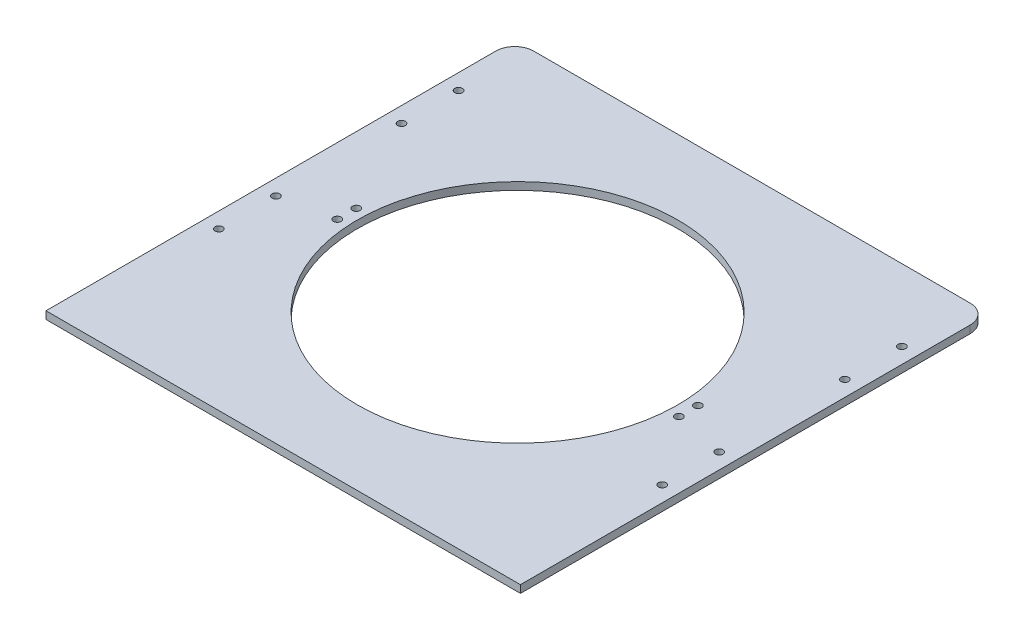
ISO-10303-21;
HEADER;
FILE_DESCRIPTION(('STEP AP214'),'2;1');
FILE_NAME('part.step','',(''),(''),'','','');
FILE_SCHEMA(('AUTOMOTIVE_DESIGN { 1 0 10303 214 1 1 1 1 }'));
ENDSEC;
DATA;
#1=APPLICATION_CONTEXT('core data for automotive mechanical design processes');
#2=APPLICATION_PROTOCOL_DEFINITION('international standard','automotive_design',2000,#1);
#3=PRODUCT_CONTEXT('',#1,'mechanical');
#4=PRODUCT('Part','Part','',(#3));
#5=PRODUCT_RELATED_PRODUCT_CATEGORY('part','',(#4));
#6=PRODUCT_DEFINITION_FORMATION('','',#4);
#7=PRODUCT_DEFINITION_CONTEXT('part definition',#1,'design');
#8=PRODUCT_DEFINITION('design','',#6,#7);
#9=PRODUCT_DEFINITION_SHAPE('','',#8);
#10=(LENGTH_UNIT() NAMED_UNIT(*) SI_UNIT(.MILLI.,.METRE.));
#11=(NAMED_UNIT(*) PLANE_ANGLE_UNIT() SI_UNIT($,.RADIAN.));
#12=(NAMED_UNIT(*) SI_UNIT($,.STERADIAN.) SOLID_ANGLE_UNIT());
#13=UNCERTAINTY_MEASURE_WITH_UNIT(LENGTH_MEASURE(1.E-05),#10,'distance_accuracy_value','');
#14=(GEOMETRIC_REPRESENTATION_CONTEXT(3) GLOBAL_UNCERTAINTY_ASSIGNED_CONTEXT((#13)) GLOBAL_UNIT_ASSIGNED_CONTEXT((#10,
#11,#12)) REPRESENTATION_CONTEXT('',''));
#15=CARTESIAN_POINT('',(0.,0.,0.));
#16=DIRECTION('',(0.,0.,1.));
#17=DIRECTION('',(1.,0.,0.));
#18=AXIS2_PLACEMENT_3D('',#15,#16,#17);
#19=CARTESIAN_POINT('',(-125.,4.,123.5));
#20=DIRECTION('',(1.,0.,0.));
#21=DIRECTION('',(0.,0.,-1.));
#22=AXIS2_PLACEMENT_3D('',#19,#20,#21);
#23=PLANE('',#22);
#24=DIRECTION('',(0.,0.,1.));
#25=VECTOR('',#24,1.);
#26=CARTESIAN_POINT('',(-125.,0.,123.5));
#27=LINE('',#26,#25);
#28=CARTESIAN_POINT('',(-125.,0.,-113.5));
#29=VERTEX_POINT('',#28);
#30=CARTESIAN_POINT('',(-125.,0.,123.5));
#31=VERTEX_POINT('',#30);
#32=EDGE_CURVE('E127',#29,#31,#27,.T.);
#33=ORIENTED_EDGE('',*,*,#32,.T.);
#34=DIRECTION('',(0.,-1.,0.));
#35=VECTOR('',#34,1.);
#36=CARTESIAN_POINT('',(-125.,4.,123.5));
#37=LINE('',#36,#35);
#38=CARTESIAN_POINT('',(-125.,4.,123.5));
#39=VERTEX_POINT('',#38);
#40=EDGE_CURVE('E11',#39,#31,#37,.T.);
#41=ORIENTED_EDGE('',*,*,#40,.F.);
#42=DIRECTION('',(0.,0.,1.));
#43=VECTOR('',#42,1.);
#44=CARTESIAN_POINT('',(-125.,4.,123.5));
#45=LINE('',#44,#43);
#46=CARTESIAN_POINT('',(-125.,4.,-113.5));
#47=VERTEX_POINT('',#46);
#48=EDGE_CURVE('E138',#47,#39,#45,.T.);
#49=ORIENTED_EDGE('',*,*,#48,.F.);
#50=DIRECTION('',(0.,-1.,0.));
#51=VECTOR('',#50,1.);
#52=CARTESIAN_POINT('',(-125.,4.,-113.5));
#53=LINE('',#52,#51);
#54=EDGE_CURVE('E123',#47,#29,#53,.T.);
#55=ORIENTED_EDGE('',*,*,#54,.T.);
#56=EDGE_LOOP('',(#33,#41,#49,#55));
#57=FACE_BOUND('',#56,.T.);
#58=ADVANCED_FACE('F41',(#57),#23,.F.);
#59=CARTESIAN_POINT('',(-125.,4.,123.5));
#60=DIRECTION('',(0.,0.,-1.));
#61=DIRECTION('',(-1.,0.,0.));
#62=AXIS2_PLACEMENT_3D('',#59,#60,#61);
#63=PLANE('',#62);
#64=DIRECTION('',(1.,0.,0.));
#65=VECTOR('',#64,1.);
#66=CARTESIAN_POINT('',(-125.,0.,123.5));
#67=LINE('',#66,#65);
#68=CARTESIAN_POINT('',(125.,0.,123.5));
#69=VERTEX_POINT('',#68);
#70=EDGE_CURVE('E130',#31,#69,#67,.T.);
#71=ORIENTED_EDGE('',*,*,#70,.T.);
#72=DIRECTION('',(0.,-1.,0.));
#73=VECTOR('',#72,1.);
#74=CARTESIAN_POINT('',(125.,4.,123.5));
#75=LINE('',#74,#73);
#76=CARTESIAN_POINT('',(125.,4.,123.5));
#77=VERTEX_POINT('',#76);
#78=EDGE_CURVE('E50',#77,#69,#75,.T.);
#79=ORIENTED_EDGE('',*,*,#78,.F.);
#80=DIRECTION('',(1.,0.,0.));
#81=VECTOR('',#80,1.);
#82=CARTESIAN_POINT('',(-125.,4.,123.5));
#83=LINE('',#82,#81);
#84=EDGE_CURVE('E96',#39,#77,#83,.T.);
#85=ORIENTED_EDGE('',*,*,#84,.F.);
#86=ORIENTED_EDGE('',*,*,#40,.T.);
#87=EDGE_LOOP('',(#71,#79,#85,#86));
#88=FACE_BOUND('',#87,.T.);
#89=ADVANCED_FACE('F189',(#88),#63,.F.);
#90=CARTESIAN_POINT('',(125.,4.,123.5));
#91=DIRECTION('',(-1.,0.,0.));
#92=DIRECTION('',(0.,0.,1.));
#93=AXIS2_PLACEMENT_3D('',#90,#91,#92);
#94=PLANE('',#93);
#95=DIRECTION('',(0.,0.,-1.));
#96=VECTOR('',#95,1.);
#97=CARTESIAN_POINT('',(125.,0.,123.5));
#98=LINE('',#97,#96);
#99=CARTESIAN_POINT('',(125.,0.,-113.5));
#100=VERTEX_POINT('',#99);
#101=EDGE_CURVE('E133',#69,#100,#98,.T.);
#102=ORIENTED_EDGE('',*,*,#101,.T.);
#103=DIRECTION('',(0.,-1.,0.));
#104=VECTOR('',#103,1.);
#105=CARTESIAN_POINT('',(125.,4.,-113.5));
#106=LINE('',#105,#104);
#107=CARTESIAN_POINT('',(125.,4.,-113.5));
#108=VERTEX_POINT('',#107);
#109=EDGE_CURVE('E118',#108,#100,#106,.T.);
#110=ORIENTED_EDGE('',*,*,#109,.F.);
#111=DIRECTION('',(0.,0.,-1.));
#112=VECTOR('',#111,1.);
#113=CARTESIAN_POINT('',(125.,4.,123.5));
#114=LINE('',#113,#112);
#115=EDGE_CURVE('E109',#77,#108,#114,.T.);
#116=ORIENTED_EDGE('',*,*,#115,.F.);
#117=ORIENTED_EDGE('',*,*,#78,.T.);
#118=EDGE_LOOP('',(#102,#110,#116,#117));
#119=FACE_BOUND('',#118,.T.);
#120=ADVANCED_FACE('F192',(#119),#94,.F.);
#121=CARTESIAN_POINT('',(115.,4.,-113.5));
#122=DIRECTION('',(0.,-1.,0.));
#123=DIRECTION('',(0.,0.,-1.));
#124=AXIS2_PLACEMENT_3D('',#121,#122,#123);
#125=CYLINDRICAL_SURFACE('',#124,9.99999999999999);
#126=CARTESIAN_POINT('',(115.,0.,-113.5));
#127=DIRECTION('',(0.,1.,0.));
#128=DIRECTION('',(0.,0.,-1.));
#129=AXIS2_PLACEMENT_3D('',#126,#127,#128);
#130=CIRCLE('',#129,9.99999999999999);
#131=CARTESIAN_POINT('',(115.,0.,-123.5));
#132=VERTEX_POINT('',#131);
#133=EDGE_CURVE('E117',#100,#132,#130,.T.);
#134=ORIENTED_EDGE('',*,*,#133,.T.);
#135=DIRECTION('',(0.,-1.,0.));
#136=VECTOR('',#135,1.);
#137=CARTESIAN_POINT('',(115.,4.,-123.5));
#138=LINE('',#137,#136);
#139=CARTESIAN_POINT('',(115.,4.,-123.5));
#140=VERTEX_POINT('',#139);
#141=EDGE_CURVE('E114',#140,#132,#138,.T.);
#142=ORIENTED_EDGE('',*,*,#141,.F.);
#143=CARTESIAN_POINT('',(115.,4.,-113.5));
#144=DIRECTION('',(0.,1.,0.));
#145=DIRECTION('',(0.,0.,-1.));
#146=AXIS2_PLACEMENT_3D('',#143,#144,#145);
#147=CIRCLE('',#146,9.99999999999999);
#148=EDGE_CURVE('E103',#108,#140,#147,.T.);
#149=ORIENTED_EDGE('',*,*,#148,.F.);
#150=ORIENTED_EDGE('',*,*,#109,.T.);
#151=EDGE_LOOP('',(#134,#142,#149,#150));
#152=FACE_BOUND('',#151,.T.);
#153=ADVANCED_FACE('F115',(#152),#125,.T.);
#154=CARTESIAN_POINT('',(-115.,4.,-123.5));
#155=DIRECTION('',(0.,0.,1.));
#156=DIRECTION('',(1.,0.,0.));
#157=AXIS2_PLACEMENT_3D('',#154,#155,#156);
#158=PLANE('',#157);
#159=DIRECTION('',(-1.,0.,0.));
#160=VECTOR('',#159,1.);
#161=CARTESIAN_POINT('',(-115.,0.,-123.5));
#162=LINE('',#161,#160);
#163=CARTESIAN_POINT('',(-115.,0.,-123.5));
#164=VERTEX_POINT('',#163);
#165=EDGE_CURVE('E82',#132,#164,#162,.T.);
#166=ORIENTED_EDGE('',*,*,#165,.T.);
#167=DIRECTION('',(0.,-1.,0.));
#168=VECTOR('',#167,1.);
#169=CARTESIAN_POINT('',(-115.,4.,-123.5));
#170=LINE('',#169,#168);
#171=CARTESIAN_POINT('',(-115.,4.,-123.5));
#172=VERTEX_POINT('',#171);
#173=EDGE_CURVE('E119',#172,#164,#170,.T.);
#174=ORIENTED_EDGE('',*,*,#173,.F.);
#175=DIRECTION('',(-1.,0.,0.));
#176=VECTOR('',#175,1.);
#177=CARTESIAN_POINT('',(-115.,4.,-123.5));
#178=LINE('',#177,#176);
#179=EDGE_CURVE('E107',#140,#172,#178,.T.);
#180=ORIENTED_EDGE('',*,*,#179,.F.);
#181=ORIENTED_EDGE('',*,*,#141,.T.);
#182=EDGE_LOOP('',(#166,#174,#180,#181));
#183=FACE_BOUND('',#182,.T.);
#184=ADVANCED_FACE('F121',(#183),#158,.F.);
#185=CARTESIAN_POINT('',(-115.,4.,-113.5));
#186=DIRECTION('',(0.,-1.,0.));
#187=DIRECTION('',(0.,0.,-1.));
#188=AXIS2_PLACEMENT_3D('',#185,#186,#187);
#189=CYLINDRICAL_SURFACE('',#188,9.99999999999999);
#190=CARTESIAN_POINT('',(-115.,0.,-113.5));
#191=DIRECTION('',(0.,1.,0.));
#192=DIRECTION('',(0.,0.,-1.));
#193=AXIS2_PLACEMENT_3D('',#190,#191,#192);
#194=CIRCLE('',#193,9.99999999999999);
#195=EDGE_CURVE('E88',#164,#29,#194,.T.);
#196=ORIENTED_EDGE('',*,*,#195,.T.);
#197=ORIENTED_EDGE('',*,*,#54,.F.);
#198=CARTESIAN_POINT('',(-115.,4.,-113.5));
#199=DIRECTION('',(0.,1.,0.));
#200=DIRECTION('',(0.,0.,-1.));
#201=AXIS2_PLACEMENT_3D('',#198,#199,#200);
#202=CIRCLE('',#201,9.99999999999999);
#203=EDGE_CURVE('E59',#172,#47,#202,.T.);
#204=ORIENTED_EDGE('',*,*,#203,.F.);
#205=ORIENTED_EDGE('',*,*,#173,.T.);
#206=EDGE_LOOP('',(#196,#197,#204,#205));
#207=FACE_BOUND('',#206,.T.);
#208=ADVANCED_FACE('F197',(#207),#189,.T.);
#209=CARTESIAN_POINT('',(-115.,4.,-113.5));
#210=DIRECTION('',(0.,-1.,0.));
#211=DIRECTION('',(0.,0.,-1.));
#212=AXIS2_PLACEMENT_3D('',#209,#210,#211);
#213=PLANE('',#212);
#214=CARTESIAN_POINT('',(-116.8,4.,-55.65));
#215=DIRECTION('',(0.,1.,0.));
#216=DIRECTION('',(0.,0.,1.));
#217=AXIS2_PLACEMENT_3D('',#214,#215,#216);
#218=CIRCLE('',#217,2.);
#219=CARTESIAN_POINT('',(-116.8,4.,-53.65));
#220=VERTEX_POINT('',#219);
#221=EDGE_CURVE('E380',#220,#220,#218,.T.);
#222=ORIENTED_EDGE('',*,*,#221,.F.);
#223=EDGE_LOOP('',(#222));
#224=FACE_BOUND('',#223,.T.);
#225=CARTESIAN_POINT('',(-116.8,4.,10.55));
#226=DIRECTION('',(0.,1.,0.));
#227=DIRECTION('',(0.,0.,1.));
#228=AXIS2_PLACEMENT_3D('',#225,#226,#227);
#229=CIRCLE('',#228,2.);
#230=CARTESIAN_POINT('',(-116.8,4.,12.55));
#231=VERTEX_POINT('',#230);
#232=EDGE_CURVE('E381',#231,#231,#229,.T.);
#233=ORIENTED_EDGE('',*,*,#232,.F.);
#234=EDGE_LOOP('',(#233));
#235=FACE_BOUND('',#234,.T.);
#236=CARTESIAN_POINT('',(-116.8,4.,40.6));
#237=DIRECTION('',(0.,1.,0.));
#238=DIRECTION('',(0.,0.,1.));
#239=AXIS2_PLACEMENT_3D('',#236,#237,#238);
#240=CIRCLE('',#239,2.);
#241=CARTESIAN_POINT('',(-116.8,4.,42.6));
#242=VERTEX_POINT('',#241);
#243=EDGE_CURVE('E386',#242,#242,#240,.T.);
#244=ORIENTED_EDGE('',*,*,#243,.F.);
#245=EDGE_LOOP('',(#244));
#246=FACE_BOUND('',#245,.T.);
#247=CARTESIAN_POINT('',(116.8,4.,40.6));
#248=DIRECTION('',(0.,1.,0.));
#249=DIRECTION('',(0.,0.,-1.));
#250=AXIS2_PLACEMENT_3D('',#247,#248,#249);
#251=CIRCLE('',#250,2.);
#252=CARTESIAN_POINT('',(116.8,4.,38.6));
#253=VERTEX_POINT('',#252);
#254=EDGE_CURVE('E394',#253,#253,#251,.T.);
#255=ORIENTED_EDGE('',*,*,#254,.F.);
#256=EDGE_LOOP('',(#255));
#257=FACE_BOUND('',#256,.T.);
#258=CARTESIAN_POINT('',(116.8,4.,10.55));
#259=DIRECTION('',(0.,1.,0.));
#260=DIRECTION('',(0.,0.,-1.));
#261=AXIS2_PLACEMENT_3D('',#258,#259,#260);
#262=CIRCLE('',#261,2.);
#263=CARTESIAN_POINT('',(116.8,4.,8.54999999999999));
#264=VERTEX_POINT('',#263);
#265=EDGE_CURVE('E396',#264,#264,#262,.T.);
#266=ORIENTED_EDGE('',*,*,#265,.F.);
#267=EDGE_LOOP('',(#266));
#268=FACE_BOUND('',#267,.T.);
#269=CARTESIAN_POINT('',(116.8,4.,-55.65));
#270=DIRECTION('',(0.,1.,0.));
#271=DIRECTION('',(0.,0.,-1.));
#272=AXIS2_PLACEMENT_3D('',#269,#270,#271);
#273=CIRCLE('',#272,2.);
#274=CARTESIAN_POINT('',(116.8,4.,-57.65));
#275=VERTEX_POINT('',#274);
#276=EDGE_CURVE('E435',#275,#275,#273,.T.);
#277=ORIENTED_EDGE('',*,*,#276,.F.);
#278=EDGE_LOOP('',(#277));
#279=FACE_BOUND('',#278,.T.);
#280=CARTESIAN_POINT('',(116.8,4.,-85.7));
#281=DIRECTION('',(0.,1.,0.));
#282=DIRECTION('',(0.,0.,-1.));
#283=AXIS2_PLACEMENT_3D('',#280,#281,#282);
#284=CIRCLE('',#283,2.);
#285=CARTESIAN_POINT('',(116.8,4.,-87.7));
#286=VERTEX_POINT('',#285);
#287=EDGE_CURVE('E389',#286,#286,#284,.T.);
#288=ORIENTED_EDGE('',*,*,#287,.F.);
#289=EDGE_LOOP('',(#288));
#290=FACE_BOUND('',#289,.T.);
#291=CARTESIAN_POINT('',(-116.8,4.,-85.7));
#292=DIRECTION('',(0.,1.,0.));
#293=DIRECTION('',(0.,0.,1.));
#294=AXIS2_PLACEMENT_3D('',#291,#292,#293);
#295=CIRCLE('',#294,2.);
#296=CARTESIAN_POINT('',(-116.8,4.,-83.7));
#297=VERTEX_POINT('',#296);
#298=EDGE_CURVE('E148',#297,#297,#295,.T.);
#299=ORIENTED_EDGE('',*,*,#298,.F.);
#300=EDGE_LOOP('',(#299));
#301=FACE_BOUND('',#300,.T.);
#302=CARTESIAN_POINT('',(90.,4.,-5.));
#303=DIRECTION('',(0.,1.,0.));
#304=DIRECTION('',(0.,0.,-1.));
#305=AXIS2_PLACEMENT_3D('',#302,#303,#304);
#306=CIRCLE('',#305,2.);
#307=CARTESIAN_POINT('',(90.,4.,-7.));
#308=VERTEX_POINT('',#307);
#309=EDGE_CURVE('E171',#308,#308,#306,.T.);
#310=ORIENTED_EDGE('',*,*,#309,.F.);
#311=EDGE_LOOP('',(#310));
#312=FACE_BOUND('',#311,.T.);
#313=CARTESIAN_POINT('',(90.,4.,5.));
#314=DIRECTION('',(0.,1.,0.));
#315=DIRECTION('',(0.,0.,-1.));
#316=AXIS2_PLACEMENT_3D('',#313,#314,#315);
#317=CIRCLE('',#316,2.);
#318=CARTESIAN_POINT('',(90.,4.,3.));
#319=VERTEX_POINT('',#318);
#320=EDGE_CURVE('E409',#319,#319,#317,.T.);
#321=ORIENTED_EDGE('',*,*,#320,.F.);
#322=EDGE_LOOP('',(#321));
#323=FACE_BOUND('',#322,.T.);
#324=CARTESIAN_POINT('',(-90.,4.,5.));
#325=DIRECTION('',(0.,1.,0.));
#326=DIRECTION('',(0.,0.,1.));
#327=AXIS2_PLACEMENT_3D('',#324,#325,#326);
#328=CIRCLE('',#327,2.);
#329=CARTESIAN_POINT('',(-90.,4.,7.));
#330=VERTEX_POINT('',#329);
#331=EDGE_CURVE('E403',#330,#330,#328,.T.);
#332=ORIENTED_EDGE('',*,*,#331,.F.);
#333=EDGE_LOOP('',(#332));
#334=FACE_BOUND('',#333,.T.);
#335=CARTESIAN_POINT('',(-90.,4.,-5.));
#336=DIRECTION('',(0.,1.,0.));
#337=DIRECTION('',(0.,0.,1.));
#338=AXIS2_PLACEMENT_3D('',#335,#336,#337);
#339=CIRCLE('',#338,2.);
#340=CARTESIAN_POINT('',(-90.,4.,-3.));
#341=VERTEX_POINT('',#340);
#342=EDGE_CURVE('E185',#341,#341,#339,.T.);
#343=ORIENTED_EDGE('',*,*,#342,.F.);
#344=EDGE_LOOP('',(#343));
#345=FACE_BOUND('',#344,.T.);
#346=CARTESIAN_POINT('',(0.,4.,0.));
#347=DIRECTION('',(0.,1.,0.));
#348=DIRECTION('',(0.,0.,1.));
#349=AXIS2_PLACEMENT_3D('',#346,#347,#348);
#350=CIRCLE('',#349,84.42);
#351=CARTESIAN_POINT('',(0.,4.,84.42));
#352=VERTEX_POINT('',#351);
#353=EDGE_CURVE('E182',#352,#352,#350,.T.);
#354=ORIENTED_EDGE('',*,*,#353,.F.);
#355=EDGE_LOOP('',(#354));
#356=FACE_BOUND('',#355,.T.);
#357=ORIENTED_EDGE('',*,*,#48,.T.);
#358=ORIENTED_EDGE('',*,*,#84,.T.);
#359=ORIENTED_EDGE('',*,*,#115,.T.);
#360=ORIENTED_EDGE('',*,*,#148,.T.);
#361=ORIENTED_EDGE('',*,*,#179,.T.);
#362=ORIENTED_EDGE('',*,*,#203,.T.);
#363=EDGE_LOOP('',(#357,#358,#359,#360,#361,#362));
#364=FACE_BOUND('',#363,.T.);
#365=ADVANCED_FACE('F105',(#224,#235,#246,#257,#268,#279,#290,#301,#312,#323,#334,#345,#356,
#364),#213,.F.);
#366=CARTESIAN_POINT('',(-115.,0.,-113.5));
#367=DIRECTION('',(0.,-1.,0.));
#368=DIRECTION('',(0.,0.,-1.));
#369=AXIS2_PLACEMENT_3D('',#366,#367,#368);
#370=PLANE('',#369);
#371=CARTESIAN_POINT('',(-116.8,0.,-55.65));
#372=DIRECTION('',(0.,-1.,0.));
#373=DIRECTION('',(0.,0.,-1.));
#374=AXIS2_PLACEMENT_3D('',#371,#372,#373);
#375=CIRCLE('',#374,2.);
#376=CARTESIAN_POINT('',(-116.8,0.,-57.65));
#377=VERTEX_POINT('',#376);
#378=EDGE_CURVE('E44',#377,#377,#375,.T.);
#379=ORIENTED_EDGE('',*,*,#378,.F.);
#380=EDGE_LOOP('',(#379));
#381=FACE_BOUND('',#380,.T.);
#382=CARTESIAN_POINT('',(-116.8,0.,10.55));
#383=DIRECTION('',(0.,-1.,0.));
#384=DIRECTION('',(0.,0.,-1.));
#385=AXIS2_PLACEMENT_3D('',#382,#383,#384);
#386=CIRCLE('',#385,2.);
#387=CARTESIAN_POINT('',(-116.8,0.,8.55000000000001));
#388=VERTEX_POINT('',#387);
#389=EDGE_CURVE('E162',#388,#388,#386,.T.);
#390=ORIENTED_EDGE('',*,*,#389,.F.);
#391=EDGE_LOOP('',(#390));
#392=FACE_BOUND('',#391,.T.);
#393=CARTESIAN_POINT('',(-116.8,0.,40.6));
#394=DIRECTION('',(0.,-1.,0.));
#395=DIRECTION('',(0.,0.,-1.));
#396=AXIS2_PLACEMENT_3D('',#393,#394,#395);
#397=CIRCLE('',#396,2.);
#398=CARTESIAN_POINT('',(-116.8,0.,38.6));
#399=VERTEX_POINT('',#398);
#400=EDGE_CURVE('E160',#399,#399,#397,.T.);
#401=ORIENTED_EDGE('',*,*,#400,.F.);
#402=EDGE_LOOP('',(#401));
#403=FACE_BOUND('',#402,.T.);
#404=CARTESIAN_POINT('',(116.8,0.,40.6));
#405=DIRECTION('',(0.,-1.,0.));
#406=DIRECTION('',(0.,0.,-1.));
#407=AXIS2_PLACEMENT_3D('',#404,#405,#406);
#408=CIRCLE('',#407,2.);
#409=CARTESIAN_POINT('',(116.8,0.,38.6));
#410=VERTEX_POINT('',#409);
#411=EDGE_CURVE('E157',#410,#410,#408,.T.);
#412=ORIENTED_EDGE('',*,*,#411,.F.);
#413=EDGE_LOOP('',(#412));
#414=FACE_BOUND('',#413,.T.);
#415=CARTESIAN_POINT('',(116.8,0.,10.55));
#416=DIRECTION('',(0.,-1.,0.));
#417=DIRECTION('',(0.,0.,-1.));
#418=AXIS2_PLACEMENT_3D('',#415,#416,#417);
#419=CIRCLE('',#418,2.);
#420=CARTESIAN_POINT('',(116.8,0.,8.54999999999999));
#421=VERTEX_POINT('',#420);
#422=EDGE_CURVE('E154',#421,#421,#419,.T.);
#423=ORIENTED_EDGE('',*,*,#422,.F.);
#424=EDGE_LOOP('',(#423));
#425=FACE_BOUND('',#424,.T.);
#426=CARTESIAN_POINT('',(116.8,0.,-55.65));
#427=DIRECTION('',(0.,-1.,0.));
#428=DIRECTION('',(0.,0.,-1.));
#429=AXIS2_PLACEMENT_3D('',#426,#427,#428);
#430=CIRCLE('',#429,2.);
#431=CARTESIAN_POINT('',(116.8,0.,-57.65));
#432=VERTEX_POINT('',#431);
#433=EDGE_CURVE('E151',#432,#432,#430,.T.);
#434=ORIENTED_EDGE('',*,*,#433,.F.);
#435=EDGE_LOOP('',(#434));
#436=FACE_BOUND('',#435,.T.);
#437=CARTESIAN_POINT('',(116.8,0.,-85.7));
#438=DIRECTION('',(0.,-1.,0.));
#439=DIRECTION('',(0.,0.,-1.));
#440=AXIS2_PLACEMENT_3D('',#437,#438,#439);
#441=CIRCLE('',#440,2.);
#442=CARTESIAN_POINT('',(116.8,0.,-87.7));
#443=VERTEX_POINT('',#442);
#444=EDGE_CURVE('E147',#443,#443,#441,.T.);
#445=ORIENTED_EDGE('',*,*,#444,.F.);
#446=EDGE_LOOP('',(#445));
#447=FACE_BOUND('',#446,.T.);
#448=CARTESIAN_POINT('',(-116.8,0.,-85.7));
#449=DIRECTION('',(0.,-1.,0.));
#450=DIRECTION('',(0.,0.,-1.));
#451=AXIS2_PLACEMENT_3D('',#448,#449,#450);
#452=CIRCLE('',#451,2.);
#453=CARTESIAN_POINT('',(-116.8,0.,-87.7));
#454=VERTEX_POINT('',#453);
#455=EDGE_CURVE('E144',#454,#454,#452,.T.);
#456=ORIENTED_EDGE('',*,*,#455,.F.);
#457=EDGE_LOOP('',(#456));
#458=FACE_BOUND('',#457,.T.);
#459=CARTESIAN_POINT('',(90.,0.,-5.));
#460=DIRECTION('',(0.,1.,0.));
#461=DIRECTION('',(0.,0.,-1.));
#462=AXIS2_PLACEMENT_3D('',#459,#460,#461);
#463=CIRCLE('',#462,2.);
#464=CARTESIAN_POINT('',(90.,0.,-7.));
#465=VERTEX_POINT('',#464);
#466=EDGE_CURVE('E167',#465,#465,#463,.T.);
#467=ORIENTED_EDGE('',*,*,#466,.T.);
#468=EDGE_LOOP('',(#467));
#469=FACE_BOUND('',#468,.T.);
#470=CARTESIAN_POINT('',(90.,0.,5.));
#471=DIRECTION('',(0.,1.,0.));
#472=DIRECTION('',(0.,0.,-1.));
#473=AXIS2_PLACEMENT_3D('',#470,#471,#472);
#474=CIRCLE('',#473,2.);
#475=CARTESIAN_POINT('',(90.,0.,3.));
#476=VERTEX_POINT('',#475);
#477=EDGE_CURVE('E176',#476,#476,#474,.T.);
#478=ORIENTED_EDGE('',*,*,#477,.T.);
#479=EDGE_LOOP('',(#478));
#480=FACE_BOUND('',#479,.T.);
#481=CARTESIAN_POINT('',(-90.,0.,5.));
#482=DIRECTION('',(0.,1.,0.));
#483=DIRECTION('',(0.,0.,1.));
#484=AXIS2_PLACEMENT_3D('',#481,#482,#483);
#485=CIRCLE('',#484,2.);
#486=CARTESIAN_POINT('',(-90.,0.,7.));
#487=VERTEX_POINT('',#486);
#488=EDGE_CURVE('E406',#487,#487,#485,.T.);
#489=ORIENTED_EDGE('',*,*,#488,.T.);
#490=EDGE_LOOP('',(#489));
#491=FACE_BOUND('',#490,.T.);
#492=CARTESIAN_POINT('',(-90.,0.,-5.));
#493=DIRECTION('',(0.,1.,0.));
#494=DIRECTION('',(0.,0.,1.));
#495=AXIS2_PLACEMENT_3D('',#492,#493,#494);
#496=CIRCLE('',#495,2.);
#497=CARTESIAN_POINT('',(-90.,0.,-3.));
#498=VERTEX_POINT('',#497);
#499=EDGE_CURVE('E400',#498,#498,#496,.T.);
#500=ORIENTED_EDGE('',*,*,#499,.T.);
#501=EDGE_LOOP('',(#500));
#502=FACE_BOUND('',#501,.T.);
#503=CARTESIAN_POINT('',(0.,0.,0.));
#504=DIRECTION('',(0.,1.,0.));
#505=DIRECTION('',(0.,0.,1.));
#506=AXIS2_PLACEMENT_3D('',#503,#504,#505);
#507=CIRCLE('',#506,84.42);
#508=CARTESIAN_POINT('',(0.,0.,84.42));
#509=VERTEX_POINT('',#508);
#510=EDGE_CURVE('E131',#509,#509,#507,.T.);
#511=ORIENTED_EDGE('',*,*,#510,.T.);
#512=EDGE_LOOP('',(#511));
#513=FACE_BOUND('',#512,.T.);
#514=ORIENTED_EDGE('',*,*,#32,.F.);
#515=ORIENTED_EDGE('',*,*,#195,.F.);
#516=ORIENTED_EDGE('',*,*,#165,.F.);
#517=ORIENTED_EDGE('',*,*,#133,.F.);
#518=ORIENTED_EDGE('',*,*,#101,.F.);
#519=ORIENTED_EDGE('',*,*,#70,.F.);
#520=EDGE_LOOP('',(#514,#515,#516,#517,#518,#519));
#521=FACE_BOUND('',#520,.T.);
#522=ADVANCED_FACE('F195',(#381,#392,#403,#414,#425,#436,#447,#458,#469,#480,#491,#502,#513,
#521),#370,.T.);
#523=CARTESIAN_POINT('',(0.,0.,0.));
#524=DIRECTION('',(0.,1.,0.));
#525=DIRECTION('',(0.,0.,1.));
#526=AXIS2_PLACEMENT_3D('',#523,#524,#525);
#527=CYLINDRICAL_SURFACE('',#526,84.42);
#528=ORIENTED_EDGE('',*,*,#510,.F.);
#529=EDGE_LOOP('',(#528));
#530=FACE_BOUND('',#529,.T.);
#531=ORIENTED_EDGE('',*,*,#353,.T.);
#532=EDGE_LOOP('',(#531));
#533=FACE_BOUND('',#532,.T.);
#534=ADVANCED_FACE('F249',(#530,#533),#527,.F.);
#535=CARTESIAN_POINT('',(-90.,0.,-5.));
#536=DIRECTION('',(0.,1.,0.));
#537=DIRECTION('',(0.,0.,1.));
#538=AXIS2_PLACEMENT_3D('',#535,#536,#537);
#539=CYLINDRICAL_SURFACE('',#538,2.);
#540=ORIENTED_EDGE('',*,*,#499,.F.);
#541=EDGE_LOOP('',(#540));
#542=FACE_BOUND('',#541,.T.);
#543=ORIENTED_EDGE('',*,*,#342,.T.);
#544=EDGE_LOOP('',(#543));
#545=FACE_BOUND('',#544,.T.);
#546=ADVANCED_FACE('F258',(#542,#545),#539,.F.);
#547=CARTESIAN_POINT('',(-90.,0.,5.));
#548=DIRECTION('',(0.,1.,0.));
#549=DIRECTION('',(0.,0.,1.));
#550=AXIS2_PLACEMENT_3D('',#547,#548,#549);
#551=CYLINDRICAL_SURFACE('',#550,2.);
#552=ORIENTED_EDGE('',*,*,#488,.F.);
#553=EDGE_LOOP('',(#552));
#554=FACE_BOUND('',#553,.T.);
#555=ORIENTED_EDGE('',*,*,#331,.T.);
#556=EDGE_LOOP('',(#555));
#557=FACE_BOUND('',#556,.T.);
#558=ADVANCED_FACE('F268',(#554,#557),#551,.F.);
#559=CARTESIAN_POINT('',(90.,0.,5.));
#560=DIRECTION('',(0.,1.,0.));
#561=DIRECTION('',(0.,0.,1.));
#562=AXIS2_PLACEMENT_3D('',#559,#560,#561);
#563=CYLINDRICAL_SURFACE('',#562,2.);
#564=ORIENTED_EDGE('',*,*,#477,.F.);
#565=EDGE_LOOP('',(#564));
#566=FACE_BOUND('',#565,.T.);
#567=ORIENTED_EDGE('',*,*,#320,.T.);
#568=EDGE_LOOP('',(#567));
#569=FACE_BOUND('',#568,.T.);
#570=ADVANCED_FACE('F278',(#566,#569),#563,.F.);
#571=CARTESIAN_POINT('',(90.,0.,-5.));
#572=DIRECTION('',(0.,1.,0.));
#573=DIRECTION('',(0.,0.,1.));
#574=AXIS2_PLACEMENT_3D('',#571,#572,#573);
#575=CYLINDRICAL_SURFACE('',#574,2.);
#576=ORIENTED_EDGE('',*,*,#466,.F.);
#577=EDGE_LOOP('',(#576));
#578=FACE_BOUND('',#577,.T.);
#579=ORIENTED_EDGE('',*,*,#309,.T.);
#580=EDGE_LOOP('',(#579));
#581=FACE_BOUND('',#580,.T.);
#582=ADVANCED_FACE('F288',(#578,#581),#575,.F.);
#583=CARTESIAN_POINT('',(-116.8,-6.,-85.7));
#584=DIRECTION('',(0.,1.,0.));
#585=DIRECTION('',(0.,0.,1.));
#586=AXIS2_PLACEMENT_3D('',#583,#584,#585);
#587=CYLINDRICAL_SURFACE('',#586,2.);
#588=ORIENTED_EDGE('',*,*,#455,.T.);
#589=EDGE_LOOP('',(#588));
#590=FACE_BOUND('',#589,.T.);
#591=ORIENTED_EDGE('',*,*,#298,.T.);
#592=EDGE_LOOP('',(#591));
#593=FACE_BOUND('',#592,.T.);
#594=ADVANCED_FACE('F297',(#590,#593),#587,.F.);
#595=CARTESIAN_POINT('',(116.8,-6.,-85.7));
#596=DIRECTION('',(0.,1.,0.));
#597=DIRECTION('',(0.,0.,1.));
#598=AXIS2_PLACEMENT_3D('',#595,#596,#597);
#599=CYLINDRICAL_SURFACE('',#598,2.);
#600=ORIENTED_EDGE('',*,*,#444,.T.);
#601=EDGE_LOOP('',(#600));
#602=FACE_BOUND('',#601,.T.);
#603=ORIENTED_EDGE('',*,*,#287,.T.);
#604=EDGE_LOOP('',(#603));
#605=FACE_BOUND('',#604,.T.);
#606=ADVANCED_FACE('F306',(#602,#605),#599,.F.);
#607=CARTESIAN_POINT('',(116.8,-6.,-55.65));
#608=DIRECTION('',(0.,1.,0.));
#609=DIRECTION('',(0.,0.,1.));
#610=AXIS2_PLACEMENT_3D('',#607,#608,#609);
#611=CYLINDRICAL_SURFACE('',#610,2.);
#612=ORIENTED_EDGE('',*,*,#433,.T.);
#613=EDGE_LOOP('',(#612));
#614=FACE_BOUND('',#613,.T.);
#615=ORIENTED_EDGE('',*,*,#276,.T.);
#616=EDGE_LOOP('',(#615));
#617=FACE_BOUND('',#616,.T.);
#618=ADVANCED_FACE('F316',(#614,#617),#611,.F.);
#619=CARTESIAN_POINT('',(116.8,-6.,10.55));
#620=DIRECTION('',(0.,1.,0.));
#621=DIRECTION('',(0.,0.,1.));
#622=AXIS2_PLACEMENT_3D('',#619,#620,#621);
#623=CYLINDRICAL_SURFACE('',#622,2.);
#624=ORIENTED_EDGE('',*,*,#422,.T.);
#625=EDGE_LOOP('',(#624));
#626=FACE_BOUND('',#625,.T.);
#627=ORIENTED_EDGE('',*,*,#265,.T.);
#628=EDGE_LOOP('',(#627));
#629=FACE_BOUND('',#628,.T.);
#630=ADVANCED_FACE('F326',(#626,#629),#623,.F.);
#631=CARTESIAN_POINT('',(116.8,-6.,40.6));
#632=DIRECTION('',(0.,1.,0.));
#633=DIRECTION('',(0.,0.,1.));
#634=AXIS2_PLACEMENT_3D('',#631,#632,#633);
#635=CYLINDRICAL_SURFACE('',#634,2.);
#636=ORIENTED_EDGE('',*,*,#411,.T.);
#637=EDGE_LOOP('',(#636));
#638=FACE_BOUND('',#637,.T.);
#639=ORIENTED_EDGE('',*,*,#254,.T.);
#640=EDGE_LOOP('',(#639));
#641=FACE_BOUND('',#640,.T.);
#642=ADVANCED_FACE('F336',(#638,#641),#635,.F.);
#643=CARTESIAN_POINT('',(-116.8,-6.,40.6));
#644=DIRECTION('',(0.,1.,0.));
#645=DIRECTION('',(0.,0.,1.));
#646=AXIS2_PLACEMENT_3D('',#643,#644,#645);
#647=CYLINDRICAL_SURFACE('',#646,2.);
#648=ORIENTED_EDGE('',*,*,#400,.T.);
#649=EDGE_LOOP('',(#648));
#650=FACE_BOUND('',#649,.T.);
#651=ORIENTED_EDGE('',*,*,#243,.T.);
#652=EDGE_LOOP('',(#651));
#653=FACE_BOUND('',#652,.T.);
#654=ADVANCED_FACE('F346',(#650,#653),#647,.F.);
#655=CARTESIAN_POINT('',(-116.8,-6.,10.55));
#656=DIRECTION('',(0.,1.,0.));
#657=DIRECTION('',(0.,0.,1.));
#658=AXIS2_PLACEMENT_3D('',#655,#656,#657);
#659=CYLINDRICAL_SURFACE('',#658,2.);
#660=ORIENTED_EDGE('',*,*,#389,.T.);
#661=EDGE_LOOP('',(#660));
#662=FACE_BOUND('',#661,.T.);
#663=ORIENTED_EDGE('',*,*,#232,.T.);
#664=EDGE_LOOP('',(#663));
#665=FACE_BOUND('',#664,.T.);
#666=ADVANCED_FACE('F356',(#662,#665),#659,.F.);
#667=CARTESIAN_POINT('',(-116.8,-6.,-55.65));
#668=DIRECTION('',(0.,1.,0.));
#669=DIRECTION('',(0.,0.,1.));
#670=AXIS2_PLACEMENT_3D('',#667,#668,#669);
#671=CYLINDRICAL_SURFACE('',#670,2.);
#672=ORIENTED_EDGE('',*,*,#378,.T.);
#673=EDGE_LOOP('',(#672));
#674=FACE_BOUND('',#673,.T.);
#675=ORIENTED_EDGE('',*,*,#221,.T.);
#676=EDGE_LOOP('',(#675));
#677=FACE_BOUND('',#676,.T.);
#678=ADVANCED_FACE('F366',(#674,#677),#671,.F.);
#679=CLOSED_SHELL('',(#58,#89,#120,#153,#184,#208,#365,#522,#534,#546,#558,#570,#582,#594,#606,
#618,#630,#642,#654,#666,#678));
#680=MANIFOLD_SOLID_BREP('B2',#679);
#681=ADVANCED_BREP_SHAPE_REPRESENTATION('',(#18,#680),#14);
#682=SHAPE_DEFINITION_REPRESENTATION(#9,#681);
ENDSEC;
END-ISO-10303-21;
